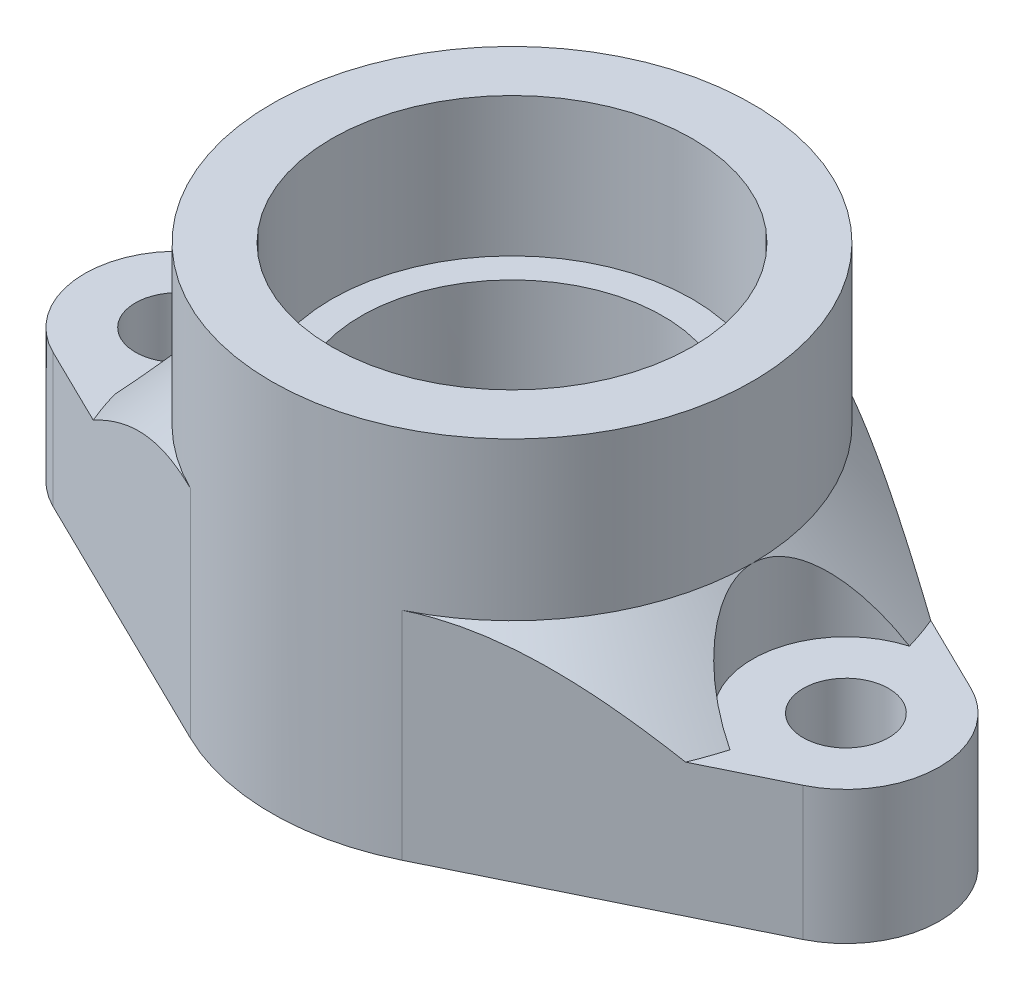
ISO-10303-21;
HEADER;
FILE_DESCRIPTION(('STEP AP214'),'2;1');
FILE_NAME('part.step','',(''),(''),'','','');
FILE_SCHEMA(('AUTOMOTIVE_DESIGN { 1 0 10303 214 1 1 1 1 }'));
ENDSEC;
DATA;
#1=APPLICATION_CONTEXT('core data for automotive mechanical design processes');
#2=APPLICATION_PROTOCOL_DEFINITION('international standard','automotive_design',2000,#1);
#3=PRODUCT_CONTEXT('',#1,'mechanical');
#4=PRODUCT('Part','Part','',(#3));
#5=PRODUCT_RELATED_PRODUCT_CATEGORY('part','',(#4));
#6=PRODUCT_DEFINITION_FORMATION('','',#4);
#7=PRODUCT_DEFINITION_CONTEXT('part definition',#1,'design');
#8=PRODUCT_DEFINITION('design','',#6,#7);
#9=PRODUCT_DEFINITION_SHAPE('','',#8);
#10=(LENGTH_UNIT() NAMED_UNIT(*) SI_UNIT(.MILLI.,.METRE.));
#11=(NAMED_UNIT(*) PLANE_ANGLE_UNIT() SI_UNIT($,.RADIAN.));
#12=(NAMED_UNIT(*) SI_UNIT($,.STERADIAN.) SOLID_ANGLE_UNIT());
#13=UNCERTAINTY_MEASURE_WITH_UNIT(LENGTH_MEASURE(1.E-05),#10,'distance_accuracy_value','');
#14=(GEOMETRIC_REPRESENTATION_CONTEXT(3) GLOBAL_UNCERTAINTY_ASSIGNED_CONTEXT((#13)) GLOBAL_UNIT_ASSIGNED_CONTEXT((#10,
#11,#12)) REPRESENTATION_CONTEXT('',''));
#15=CARTESIAN_POINT('',(0.,0.,0.));
#16=DIRECTION('',(0.,0.,1.));
#17=DIRECTION('',(1.,0.,0.));
#18=AXIS2_PLACEMENT_3D('',#15,#16,#17);
#19=CARTESIAN_POINT('',(12.5,5.,0.));
#20=DIRECTION('',(0.,-1.,0.));
#21=DIRECTION('',(0.,0.,-1.));
#22=AXIS2_PLACEMENT_3D('',#19,#20,#21);
#23=CYLINDRICAL_SURFACE('',#22,1.6);
#24=CARTESIAN_POINT('',(12.5,0.,0.));
#25=DIRECTION('',(0.,1.,0.));
#26=DIRECTION('',(0.,0.,-1.));
#27=AXIS2_PLACEMENT_3D('',#24,#25,#26);
#28=CIRCLE('',#27,1.6);
#29=CARTESIAN_POINT('',(12.5,0.,-1.6));
#30=VERTEX_POINT('',#29);
#31=EDGE_CURVE('E151',#30,#30,#28,.T.);
#32=ORIENTED_EDGE('',*,*,#31,.F.);
#33=EDGE_LOOP('',(#32));
#34=FACE_BOUND('',#33,.T.);
#35=CARTESIAN_POINT('',(12.5,5.,0.));
#36=DIRECTION('',(0.,1.,0.));
#37=DIRECTION('',(0.,0.,-1.));
#38=AXIS2_PLACEMENT_3D('',#35,#36,#37);
#39=CIRCLE('',#38,1.6);
#40=CARTESIAN_POINT('',(12.5,5.,-1.6));
#41=VERTEX_POINT('',#40);
#42=EDGE_CURVE('E522',#41,#41,#39,.T.);
#43=ORIENTED_EDGE('',*,*,#42,.T.);
#44=EDGE_LOOP('',(#43));
#45=FACE_BOUND('',#44,.T.);
#46=ADVANCED_FACE('F36',(#34,#45),#23,.F.);
#47=CARTESIAN_POINT('',(0.,5.,0.));
#48=DIRECTION('',(0.,-1.,0.));
#49=DIRECTION('',(0.,0.,-1.));
#50=AXIS2_PLACEMENT_3D('',#47,#48,#49);
#51=CONICAL_SURFACE('',#50,12.,0.7679448708775);
#52=CARTESIAN_POINT('',(0.,5.,0.));
#53=DIRECTION('',(0.,-1.,0.));
#54=DIRECTION('',(0.,0.,-1.));
#55=AXIS2_PLACEMENT_3D('',#52,#53,#54);
#56=CIRCLE('',#55,12.);
#57=CARTESIAN_POINT('',(11.52,5.,3.36));
#58=VERTEX_POINT('',#57);
#59=CARTESIAN_POINT('',(11.0876363543604,5.,4.58958822482644));
#60=VERTEX_POINT('',#59);
#61=EDGE_CURVE('E146',#58,#60,#56,.T.);
#62=ORIENTED_EDGE('',*,*,#61,.F.);
#63=CARTESIAN_POINT('',(11.5201854137369,4.9998,3.36005407345567));
#64=CARTESIAN_POINT('',(11.4551255723205,5.06997670309114,3.34107917887111));
#65=CARTESIAN_POINT('',(11.3906240049535,5.14014740494629,3.32022293353092));
#66=CARTESIAN_POINT('',(11.2628246654128,5.28037451418243,3.27475218835471));
#67=CARTESIAN_POINT('',(11.1995269600249,5.35043091502647,3.25013748069304));
#68=CARTESIAN_POINT('',(11.0113465355419,5.56052558678284,3.17056655644638));
#69=CARTESIAN_POINT('',(10.8884209428239,5.70022561447551,3.1099546432069));
#70=CARTESIAN_POINT('',(10.64733008884,5.97911140662985,2.97272420340115));
#71=CARTESIAN_POINT('',(10.5292377491211,6.11827183310221,2.89592593640598));
#72=CARTESIAN_POINT('',(10.3005427883019,6.39268754645746,2.72628623105515));
#73=CARTESIAN_POINT('',(10.1899324581157,6.5279467678781,2.63346166693734));
#74=CARTESIAN_POINT('',(9.96719689241056,6.80525955658878,2.42092364808055));
#75=CARTESIAN_POINT('',(9.85595328193928,6.94671136946978,2.29948082614157));
#76=CARTESIAN_POINT('',(9.64688603505492,7.21763480427477,2.0342502055353));
#77=CARTESIAN_POINT('',(9.54902426080143,7.3471401149555,1.89052850920296));
#78=CARTESIAN_POINT('',(9.39317583987713,7.55688644584457,1.61733500833641));
#79=CARTESIAN_POINT('',(9.33134464768782,7.64133601516534,1.49333308364829));
#80=CARTESIAN_POINT('',(9.22040901640465,7.79450273082853,1.23065653740558));
#81=CARTESIAN_POINT('',(9.17128343668485,7.86324598808395,1.09200683665216));
#82=CARTESIAN_POINT('',(9.09957533949147,7.96436011078433,0.836731478478237));
#83=CARTESIAN_POINT('',(9.07343890019289,8.00151550032862,0.723025611535535));
#84=CARTESIAN_POINT('',(9.03240545024842,8.06005377280862,0.489664777663858));
#85=CARTESIAN_POINT('',(9.01749593457978,8.08145420368919,0.370016588424023));
#86=CARTESIAN_POINT('',(9.00018869888545,8.10631031774768,0.127248291567309));
#87=CARTESIAN_POINT('',(8.99785968129376,8.10966746558025,0.00411280382596635));
#88=CARTESIAN_POINT('',(9.00614365296035,8.09775756475461,-0.24082076941409));
#89=CARTESIAN_POINT('',(9.01676057637107,8.08248485465335,-0.362618437010065));
#90=CARTESIAN_POINT('',(9.04868169536774,8.03681181939937,-0.592358319141251));
#91=CARTESIAN_POINT('',(9.06914944542203,8.00759676875353,-0.700663019115463));
#92=CARTESIAN_POINT('',(9.11891851536362,7.93703349524203,-0.911038537488009));
#93=CARTESIAN_POINT('',(9.14822330558602,7.89568050593778,-1.01310688787928));
#94=CARTESIAN_POINT('',(9.23441064344655,7.7750563248935,-1.27042338869232));
#95=CARTESIAN_POINT('',(9.29720247592483,7.68805601819695,-1.42005465233078));
#96=CARTESIAN_POINT('',(9.43709114993205,7.49737224567942,-1.70099074526134));
#97=CARTESIAN_POINT('',(9.51423212131716,7.3936374483072,-1.83223678795463));
#98=CARTESIAN_POINT('',(9.66213593931412,7.19815506903822,-2.05186978736148));
#99=CARTESIAN_POINT('',(9.73086655072568,7.10842814539402,-2.14348334171447));
#100=CARTESIAN_POINT('',(9.87409999566434,6.92400180063669,-2.31674244302911));
#101=CARTESIAN_POINT('',(9.94860628420127,6.82929941428804,-2.39838194712054));
#102=CARTESIAN_POINT('',(10.1026868598496,6.63616307164806,-2.55240591816164));
#103=CARTESIAN_POINT('',(10.182271126406,6.53772193162389,-2.6247712640941));
#104=CARTESIAN_POINT('',(10.3457379832917,6.33831837201882,-2.76051400958294));
#105=CARTESIAN_POINT('',(10.4296195429431,6.2373565599554,-2.82389355071467));
#106=CARTESIAN_POINT('',(10.5939305922785,6.04229280637617,-2.93700262621498));
#107=CARTESIAN_POINT('',(10.6740503049503,5.94833451764394,-2.98743373207773));
#108=CARTESIAN_POINT('',(10.837175623931,5.75939175043478,-3.08121154358327));
#109=CARTESIAN_POINT('',(10.9201813183512,5.66440724068759,-3.12455803269602));
#110=CARTESIAN_POINT('',(11.0880697801122,5.47461832163409,-3.20390458186388));
#111=CARTESIAN_POINT('',(11.1729306091213,5.37981923801961,-3.23996392673802));
#112=CARTESIAN_POINT('',(11.3449195152544,5.18994309444985,-3.30518175608423));
#113=CARTESIAN_POINT('',(11.4320470981367,5.09486609903749,-3.33434173112355));
#114=CARTESIAN_POINT('',(11.5201854137369,4.9998,-3.36005407345567));
#115=B_SPLINE_CURVE_WITH_KNOTS('',3,(#63,#64,#65,#66,#67,#68,#69,#70,#71,#72,#73,#74,#75,#76,
#77,#78,#79,#80,#81,#82,#83,#84,#85,#86,#87,#88,#89,#90,#91,#92,#93,#94,#95,#96,#97,#98,#99,
#100,#101,#102,#103,#104,#105,#106,#107,#108,#109,#110,#111,#112,#113,#114),.UNSPECIFIED.,.F.,
.F.,(4,2,2,2,2,2,2,2,2,2,2,2,2,2,2,2,2,2,2,2,2,2,2,2,2,4),(0.,0.292632865911583,
0.585281918936534,1.17167636664785,1.76496219390614,2.35762711267373,3.00741788527803,
3.65531635556667,4.14068195116354,4.62523468384836,4.99114344583423,5.35664403781615,
5.7241386352546,6.09174493876007,6.43252508199553,6.77343922538927,7.32267804733843,
7.87363481596813,8.30953392585679,8.74569583318114,9.18274300647771,9.61968584315244,
10.0196036438867,10.4195336651887,10.8160659781561,11.2125125443243),.UNSPECIFIED.);
#116=CARTESIAN_POINT('',(9.,8.10659094137176,0.));
#117=VERTEX_POINT('',#116);
#118=EDGE_CURVE('E11',#58,#117,#115,.T.);
#119=ORIENTED_EDGE('',*,*,#118,.T.);
#120=CARTESIAN_POINT('',(0.,8.10659094137176,0.));
#121=DIRECTION('',(0.,-1.,0.));
#122=DIRECTION('',(0.,0.,-1.));
#123=AXIS2_PLACEMENT_3D('',#120,#121,#122);
#124=CIRCLE('',#123,9.);
#125=CARTESIAN_POINT('',(3.96,8.10659094137176,8.08197995543171));
#126=VERTEX_POINT('',#125);
#127=EDGE_CURVE('E167',#126,#117,#124,.F.);
#128=ORIENTED_EDGE('',*,*,#127,.F.);
#129=CARTESIAN_POINT('',(11.0876363543604,5.,4.58958822482644));
#130=CARTESIAN_POINT('',(10.9146685693147,5.13190467172665,4.67433879740375));
#131=CARTESIAN_POINT('',(10.7405776505158,5.26201286307638,4.75963968187083));
#132=CARTESIAN_POINT('',(10.3898273462686,5.51798215062431,4.93149994538032));
#133=CARTESIAN_POINT('',(10.2131672373829,5.64384201609138,5.0180596788918));
#134=CARTESIAN_POINT('',(9.85616156007442,5.89120327324647,5.19298494348511));
#135=CARTESIAN_POINT('',(9.67580194242294,6.01267961330319,5.28135735839314));
#136=CARTESIAN_POINT('',(9.31198381297978,6.24970752390818,5.45962058108608));
#137=CARTESIAN_POINT('',(9.12852556449305,6.36525959453509,5.54951125985708));
#138=CARTESIAN_POINT('',(8.76427512711209,6.58571454386813,5.72798630433665));
#139=CARTESIAN_POINT('',(8.58359362728289,6.69084264966351,5.81651643473405));
#140=CARTESIAN_POINT('',(8.21880107946128,6.89343176338309,5.99525710191459));
#141=CARTESIAN_POINT('',(8.03468970792157,6.99089204340862,6.08546779722908));
#142=CARTESIAN_POINT('',(7.47751357261187,7.26947464881802,6.35847237135494));
#143=CARTESIAN_POINT('',(7.09882635967077,7.4372834120051,6.5440211318711));
#144=CARTESIAN_POINT('',(6.49316577926451,7.66246490233665,6.84078206318186));
#145=CARTESIAN_POINT('',(6.27108422571058,7.73627592117891,6.94959734816441));
#146=CARTESIAN_POINT('',(5.82262506015489,7.86555606794771,7.16933289630901));
#147=CARTESIAN_POINT('',(5.59624874584811,7.92103064589692,7.28025252362786));
#148=CARTESIAN_POINT('',(5.25220411560659,7.98914100255725,7.44882714807255));
#149=CARTESIAN_POINT('',(5.13572863255774,8.00943743774158,7.50589768220119));
#150=CARTESIAN_POINT('',(4.90209676321014,8.04443624016062,7.62037237871348));
#151=CARTESIAN_POINT('',(4.7849403978308,8.05913877834914,7.67777653084707));
#152=CARTESIAN_POINT('',(4.54995054496168,8.08276991439259,7.79291661069054));
#153=CARTESIAN_POINT('',(4.43211622866556,8.09168830512029,7.85065294449807));
#154=CARTESIAN_POINT('',(4.1961894361028,8.10360635630777,7.96625210506276));
#155=CARTESIAN_POINT('',(4.07809692386095,8.10660513134841,8.02411494944701));
#156=CARTESIAN_POINT('',(3.96,8.10659094137176,8.08197995543172));
#157=B_SPLINE_CURVE_WITH_KNOTS('',3,(#129,#130,#131,#132,#133,#134,#135,#136,#137,#138,#139,
#140,#141,#142,#143,#144,#145,#146,#147,#148,#149,#150,#151,#152,#153,#154,#155,#156),
.UNSPECIFIED.,.F.,.F.,(4,2,2,2,2,2,2,2,2,2,2,2,2,4),(0.,0.700367614626449,1.40093641268035,
2.1050221126994,2.80904828134457,3.48992506433244,4.17086640444912,5.52977131135749,
6.30349287971398,7.0769842725491,7.47073612104756,7.86447593521898,8.2589086942665,
8.65340044563336),.UNSPECIFIED.);
#158=EDGE_CURVE('E155',#60,#126,#157,.T.);
#159=ORIENTED_EDGE('',*,*,#158,.F.);
#160=EDGE_LOOP('',(#62,#119,#128,#159));
#161=FACE_BOUND('',#160,.T.);
#162=ADVANCED_FACE('F154',(#161),#51,.T.);
#163=CARTESIAN_POINT('',(-12.5,5.,0.));
#164=DIRECTION('',(0.,-1.,0.));
#165=DIRECTION('',(0.,0.,-1.));
#166=AXIS2_PLACEMENT_3D('',#163,#164,#165);
#167=CYLINDRICAL_SURFACE('',#166,1.6);
#168=CARTESIAN_POINT('',(-12.5,0.,0.));
#169=DIRECTION('',(0.,-1.,0.));
#170=DIRECTION('',(0.,0.,-1.));
#171=AXIS2_PLACEMENT_3D('',#168,#169,#170);
#172=CIRCLE('',#171,1.6);
#173=CARTESIAN_POINT('',(-12.5,0.,-1.6));
#174=VERTEX_POINT('',#173);
#175=EDGE_CURVE('E496',#174,#174,#172,.T.);
#176=ORIENTED_EDGE('',*,*,#175,.T.);
#177=EDGE_LOOP('',(#176));
#178=FACE_BOUND('',#177,.T.);
#179=CARTESIAN_POINT('',(-12.5,5.,0.));
#180=DIRECTION('',(0.,-1.,0.));
#181=DIRECTION('',(0.,0.,-1.));
#182=AXIS2_PLACEMENT_3D('',#179,#180,#181);
#183=CIRCLE('',#182,1.6);
#184=CARTESIAN_POINT('',(-12.5,5.,-1.6));
#185=VERTEX_POINT('',#184);
#186=EDGE_CURVE('E489',#185,#185,#183,.T.);
#187=ORIENTED_EDGE('',*,*,#186,.F.);
#188=EDGE_LOOP('',(#187));
#189=FACE_BOUND('',#188,.T.);
#190=ADVANCED_FACE('F195',(#178,#189),#167,.F.);
#191=CARTESIAN_POINT('',(0.,8.10659094137176,0.));
#192=DIRECTION('',(0.,-1.,0.));
#193=DIRECTION('',(0.,0.,-1.));
#194=AXIS2_PLACEMENT_3D('',#191,#192,#193);
#195=CONICAL_SURFACE('',#194,9.,0.7679448708775);
#196=CARTESIAN_POINT('',(-11.5201854137369,4.9998,3.36005407345567));
#197=CARTESIAN_POINT('',(-11.4551255723205,5.06997670309114,3.34107917887111));
#198=CARTESIAN_POINT('',(-11.3906240049535,5.14014740494629,3.32022293353092));
#199=CARTESIAN_POINT('',(-11.2628246654128,5.28037451418243,3.27475218835471));
#200=CARTESIAN_POINT('',(-11.1995269600249,5.35043091502647,3.25013748069304));
#201=CARTESIAN_POINT('',(-11.0113465355419,5.56052558678285,3.17056655644638));
#202=CARTESIAN_POINT('',(-10.8884209428239,5.70022561447551,3.10995464320689));
#203=CARTESIAN_POINT('',(-10.64733008884,5.97911140662985,2.97272420340115));
#204=CARTESIAN_POINT('',(-10.5292377491211,6.11827183310221,2.89592593640598));
#205=CARTESIAN_POINT('',(-10.3005427883019,6.39268754645746,2.72628623105515));
#206=CARTESIAN_POINT('',(-10.1899324581157,6.5279467678781,2.63346166693734));
#207=CARTESIAN_POINT('',(-9.96719689241056,6.80525955658878,2.42092364808055));
#208=CARTESIAN_POINT('',(-9.85595328193928,6.94671136946978,2.29948082614157));
#209=CARTESIAN_POINT('',(-9.64688603505492,7.21763480427477,2.0342502055353));
#210=CARTESIAN_POINT('',(-9.54902426080143,7.3471401149555,1.89052850920296));
#211=CARTESIAN_POINT('',(-9.39317583987713,7.55688644584456,1.61733500833642));
#212=CARTESIAN_POINT('',(-9.33134464768782,7.64133601516534,1.4933330836483));
#213=CARTESIAN_POINT('',(-9.22040901640465,7.79450273082853,1.23065653740558));
#214=CARTESIAN_POINT('',(-9.17128343668485,7.86324598808395,1.09200683665216));
#215=CARTESIAN_POINT('',(-9.09957533949147,7.96436011078433,0.836731478478237));
#216=CARTESIAN_POINT('',(-9.07343890019289,8.00151550032862,0.723025611535535));
#217=CARTESIAN_POINT('',(-9.03240545024842,8.06005377280862,0.489664777663858));
#218=CARTESIAN_POINT('',(-9.01749593457978,8.08145420368919,0.370016588424023));
#219=CARTESIAN_POINT('',(-9.00018869888545,8.10631031774768,0.127248291567309));
#220=CARTESIAN_POINT('',(-8.99785968129376,8.10966746558025,0.00411280382596605));
#221=CARTESIAN_POINT('',(-9.00614365296035,8.09775756475461,-0.240820769414091));
#222=CARTESIAN_POINT('',(-9.01676057637107,8.08248485465335,-0.362618437010066));
#223=CARTESIAN_POINT('',(-9.04868169536774,8.03681181939937,-0.592358319141251));
#224=CARTESIAN_POINT('',(-9.06914944542203,8.00759676875353,-0.700663019115463));
#225=CARTESIAN_POINT('',(-9.11891851536362,7.93703349524203,-0.911038537488009));
#226=CARTESIAN_POINT('',(-9.14822330558602,7.89568050593778,-1.01310688787928));
#227=CARTESIAN_POINT('',(-9.23441064344655,7.7750563248935,-1.27042338869232));
#228=CARTESIAN_POINT('',(-9.29720247592483,7.68805601819694,-1.42005465233078));
#229=CARTESIAN_POINT('',(-9.43709114993205,7.49737224567942,-1.70099074526134));
#230=CARTESIAN_POINT('',(-9.51423212131716,7.3936374483072,-1.83223678795463));
#231=CARTESIAN_POINT('',(-9.66213593931412,7.19815506903822,-2.05186978736148));
#232=CARTESIAN_POINT('',(-9.73086655072568,7.10842814539401,-2.14348334171447));
#233=CARTESIAN_POINT('',(-9.87409999566434,6.92400180063669,-2.31674244302911));
#234=CARTESIAN_POINT('',(-9.94860628420127,6.82929941428804,-2.39838194712054));
#235=CARTESIAN_POINT('',(-10.1026868598496,6.63616307164806,-2.55240591816164));
#236=CARTESIAN_POINT('',(-10.182271126406,6.53772193162389,-2.6247712640941));
#237=CARTESIAN_POINT('',(-10.3457379832917,6.33831837201882,-2.76051400958294));
#238=CARTESIAN_POINT('',(-10.4296195429431,6.2373565599554,-2.82389355071467));
#239=CARTESIAN_POINT('',(-10.5939305922785,6.04229280637617,-2.93700262621498));
#240=CARTESIAN_POINT('',(-10.6740503049503,5.94833451764394,-2.98743373207773));
#241=CARTESIAN_POINT('',(-10.837175623931,5.75939175043479,-3.08121154358327));
#242=CARTESIAN_POINT('',(-10.9201813183512,5.66440724068759,-3.12455803269602));
#243=CARTESIAN_POINT('',(-11.0880697801122,5.47461832163409,-3.20390458186387));
#244=CARTESIAN_POINT('',(-11.1729306091213,5.37981923801961,-3.23996392673802));
#245=CARTESIAN_POINT('',(-11.3449195152544,5.18994309444985,-3.30518175608423));
#246=CARTESIAN_POINT('',(-11.4320470981367,5.09486609903749,-3.33434173112355));
#247=CARTESIAN_POINT('',(-11.5201854137369,4.9998,-3.36005407345567));
#248=B_SPLINE_CURVE_WITH_KNOTS('',3,(#196,#197,#198,#199,#200,#201,#202,#203,#204,#205,#206,
#207,#208,#209,#210,#211,#212,#213,#214,#215,#216,#217,#218,#219,#220,#221,#222,#223,#224,#225,
#226,#227,#228,#229,#230,#231,#232,#233,#234,#235,#236,#237,#238,#239,#240,#241,#242,#243,#244,
#245,#246,#247),.UNSPECIFIED.,.F.,.F.,(4,2,2,2,2,2,2,2,2,2,2,2,2,2,2,2,2,2,2,2,2,2,2,2,2,4),(0.,
0.292632865911584,0.585281918936535,1.17167636664785,1.76496219390614,2.35762711267373,
3.00741788527803,3.65531635556667,4.14068195116353,4.62523468384836,4.99114344583423,
5.35664403781615,5.7241386352546,6.09174493876006,6.43252508199552,6.77343922538927,
7.32267804733843,7.87363481596812,8.30953392585679,8.74569583318114,9.1827430064777,
9.61968584315244,10.0196036438867,10.4195336651887,10.8160659781561,11.2125125443243),.UNSPECIFIED.);
#249=CARTESIAN_POINT('',(-11.52,5.,3.36));
#250=VERTEX_POINT('',#249);
#251=CARTESIAN_POINT('',(-9.,8.10659094137176,0.));
#252=VERTEX_POINT('',#251);
#253=EDGE_CURVE('E156',#250,#252,#248,.T.);
#254=ORIENTED_EDGE('',*,*,#253,.F.);
#255=CARTESIAN_POINT('',(0.,5.,0.));
#256=DIRECTION('',(0.,-1.,0.));
#257=DIRECTION('',(0.,0.,-1.));
#258=AXIS2_PLACEMENT_3D('',#255,#256,#257);
#259=CIRCLE('',#258,12.);
#260=CARTESIAN_POINT('',(-11.0876363543604,5.,4.58958822482644));
#261=VERTEX_POINT('',#260);
#262=EDGE_CURVE('E219',#261,#250,#259,.T.);
#263=ORIENTED_EDGE('',*,*,#262,.F.);
#264=CARTESIAN_POINT('',(-3.96,8.10659094137176,8.08197995543171));
#265=CARTESIAN_POINT('',(-4.06147756358627,8.10659621286518,8.03225808603614));
#266=CARTESIAN_POINT('',(-4.16294454820575,8.10438617794866,7.98254140011154));
#267=CARTESIAN_POINT('',(-4.36571681997759,8.09558556535997,7.88318725661644));
#268=CARTESIAN_POINT('',(-4.46702212015066,8.08899536033846,7.83354979266607));
#269=CARTESIAN_POINT('',(-4.77024181314443,8.06275227769614,7.68497852784273));
#270=CARTESIAN_POINT('',(-4.97173032786682,8.03662666617197,7.58625339827044));
#271=CARTESIAN_POINT('',(-5.37015143700612,7.96849061965392,7.39103544414383));
#272=CARTESIAN_POINT('',(-5.56710978524243,7.92666326829983,7.2945300007603));
#273=CARTESIAN_POINT('',(-5.95812328572604,7.82851037725476,7.10294161889671));
#274=CARTESIAN_POINT('',(-6.15217748312106,7.77218017538598,7.00785914827417));
#275=CARTESIAN_POINT('',(-6.70098650390592,7.5930879018283,6.73895428408338));
#276=CARTESIAN_POINT('',(-7.05163835294029,7.45464319980402,6.56714226155506));
#277=CARTESIAN_POINT('',(-7.74062800453668,7.14382814849243,6.22955183997921));
#278=CARTESIAN_POINT('',(-8.07895326361057,6.97142432545952,6.06377958697676));
#279=CARTESIAN_POINT('',(-8.74628698747705,6.60015031044091,5.73680011399066));
#280=CARTESIAN_POINT('',(-9.07522069073152,6.40111553341947,5.57562952558648));
#281=CARTESIAN_POINT('',(-9.72295759799273,5.98407616585554,5.25825208009672));
#282=CARTESIAN_POINT('',(-10.0417650044373,5.76607958872115,5.10204316390508));
#283=CARTESIAN_POINT('',(-10.4797521108791,5.4526269395591,4.88743870422146));
#284=CARTESIAN_POINT('',(-10.6024778100334,5.36323355293758,4.82730569580878));
#285=CARTESIAN_POINT('',(-10.8461920979248,5.18285081329089,4.7078908265104));
#286=CARTESIAN_POINT('',(-10.9671859924096,5.09187035438888,4.64860636592004));
#287=CARTESIAN_POINT('',(-11.0876363543604,5.00000000000001,4.58958822482644));
#288=B_SPLINE_CURVE_WITH_KNOTS('',3,(#264,#265,#266,#267,#268,#269,#270,#271,#272,#273,#274,
#275,#276,#277,#278,#279,#280,#281,#282,#283,#284,#285,#286,#287),.UNSPECIFIED.,.F.,.F.,(4,2,2,
2,2,2,2,2,2,2,2,4),(0.,0.338968317002805,0.677907799371079,1.35488611304174,2.02420433407635,
2.69373798760704,3.93432499793107,5.17614103894759,6.42602056483774,7.67537442442003,
8.16528046022304,8.65300193770819),.UNSPECIFIED.);
#289=CARTESIAN_POINT('',(-3.96,8.10659094137176,8.08197995543171));
#290=VERTEX_POINT('',#289);
#291=EDGE_CURVE('E213',#290,#261,#288,.T.);
#292=ORIENTED_EDGE('',*,*,#291,.F.);
#293=CARTESIAN_POINT('',(0.,8.10659094137176,0.));
#294=DIRECTION('',(0.,-1.,0.));
#295=DIRECTION('',(0.,0.,-1.));
#296=AXIS2_PLACEMENT_3D('',#293,#294,#295);
#297=CIRCLE('',#296,9.);
#298=EDGE_CURVE('E436',#252,#290,#297,.F.);
#299=ORIENTED_EDGE('',*,*,#298,.F.);
#300=EDGE_LOOP('',(#254,#263,#292,#299));
#301=FACE_BOUND('',#300,.T.);
#302=ADVANCED_FACE('F198',(#301),#195,.T.);
#303=CARTESIAN_POINT('',(-11.52,5.,-3.36));
#304=VERTEX_POINT('',#303);
#305=EDGE_CURVE('E159',#252,#304,#248,.T.);
#306=ORIENTED_EDGE('',*,*,#305,.F.);
#307=CARTESIAN_POINT('',(-3.96,8.10659094137176,-8.08197995543172));
#308=VERTEX_POINT('',#307);
#309=EDGE_CURVE('E431',#308,#252,#297,.F.);
#310=ORIENTED_EDGE('',*,*,#309,.F.);
#311=CARTESIAN_POINT('',(-11.0876363543604,5.,-4.58958822482644));
#312=CARTESIAN_POINT('',(-10.9146685693147,5.13190467172665,-4.67433879740375));
#313=CARTESIAN_POINT('',(-10.7405776505158,5.26201286307639,-4.75963968187083));
#314=CARTESIAN_POINT('',(-10.3898273462686,5.51798215062431,-4.93149994538032));
#315=CARTESIAN_POINT('',(-10.2131672373829,5.64384201609139,-5.0180596788918));
#316=CARTESIAN_POINT('',(-9.85616156007441,5.89120327324647,-5.19298494348511));
#317=CARTESIAN_POINT('',(-9.67580194242293,6.01267961330319,-5.28135735839315));
#318=CARTESIAN_POINT('',(-9.31198381297977,6.24970752390818,-5.45962058108608));
#319=CARTESIAN_POINT('',(-9.12852556449304,6.36525959453509,-5.54951125985708));
#320=CARTESIAN_POINT('',(-8.76427512711208,6.58571454386814,-5.72798630433665));
#321=CARTESIAN_POINT('',(-8.58359362728289,6.69084264966351,-5.81651643473405));
#322=CARTESIAN_POINT('',(-8.21880107946127,6.89343176338309,-5.99525710191459));
#323=CARTESIAN_POINT('',(-8.03468970792156,6.99089204340862,-6.08546779722908));
#324=CARTESIAN_POINT('',(-7.47751357261187,7.26947464881802,-6.35847237135494));
#325=CARTESIAN_POINT('',(-7.09882635967077,7.4372834120051,-6.5440211318711));
#326=CARTESIAN_POINT('',(-6.49316577926451,7.66246490233665,-6.84078206318186));
#327=CARTESIAN_POINT('',(-6.27108422571057,7.73627592117891,-6.94959734816441));
#328=CARTESIAN_POINT('',(-5.82262506015489,7.86555606794771,-7.16933289630901));
#329=CARTESIAN_POINT('',(-5.59624874584811,7.92103064589692,-7.28025252362786));
#330=CARTESIAN_POINT('',(-5.25220411560659,7.98914100255725,-7.44882714807255));
#331=CARTESIAN_POINT('',(-5.13572863255774,8.00943743774158,-7.50589768220119));
#332=CARTESIAN_POINT('',(-4.90209676321014,8.04443624016062,-7.62037237871348));
#333=CARTESIAN_POINT('',(-4.7849403978308,8.05913877834914,-7.67777653084707));
#334=CARTESIAN_POINT('',(-4.54995054496168,8.08276991439259,-7.79291661069054));
#335=CARTESIAN_POINT('',(-4.43211622866556,8.09168830512029,-7.85065294449807));
#336=CARTESIAN_POINT('',(-4.1961894361028,8.10360635630778,-7.96625210506276));
#337=CARTESIAN_POINT('',(-4.07809692386095,8.10660513134841,-8.02411494944701));
#338=CARTESIAN_POINT('',(-3.96,8.10659094137176,-8.08197995543171));
#339=B_SPLINE_CURVE_WITH_KNOTS('',3,(#311,#312,#313,#314,#315,#316,#317,#318,#319,#320,#321,
#322,#323,#324,#325,#326,#327,#328,#329,#330,#331,#332,#333,#334,#335,#336,#337,#338),
.UNSPECIFIED.,.F.,.F.,(4,2,2,2,2,2,2,2,2,2,2,2,2,4),(0.,0.700367614626448,1.40093641268035,
2.1050221126994,2.80904828134457,3.48992506433244,4.17086640444912,5.52977131135748,
6.30349287971398,7.07698427254909,7.47073612104756,7.86447593521898,8.25890869426649,
8.65340044563336),.UNSPECIFIED.);
#340=CARTESIAN_POINT('',(-11.0876363543604,5.,-4.58958822482644));
#341=VERTEX_POINT('',#340);
#342=EDGE_CURVE('E218',#341,#308,#339,.T.);
#343=ORIENTED_EDGE('',*,*,#342,.F.);
#344=CARTESIAN_POINT('',(0.,5.,0.));
#345=DIRECTION('',(0.,-1.,0.));
#346=DIRECTION('',(0.,0.,-1.));
#347=AXIS2_PLACEMENT_3D('',#344,#345,#346);
#348=CIRCLE('',#347,12.);
#349=EDGE_CURVE('E432',#304,#341,#348,.T.);
#350=ORIENTED_EDGE('',*,*,#349,.F.);
#351=EDGE_LOOP('',(#306,#310,#343,#350));
#352=FACE_BOUND('',#351,.T.);
#353=ADVANCED_FACE('F227',(#352),#195,.T.);
#354=CARTESIAN_POINT('',(0.,14.,0.));
#355=DIRECTION('',(0.,-1.,0.));
#356=DIRECTION('',(0.,0.,-1.));
#357=AXIS2_PLACEMENT_3D('',#354,#355,#356);
#358=CYLINDRICAL_SURFACE('',#357,9.);
#359=ORIENTED_EDGE('',*,*,#127,.T.);
#360=CARTESIAN_POINT('',(3.96,8.10659094137176,-8.08197995543172));
#361=VERTEX_POINT('',#360);
#362=EDGE_CURVE('E62',#117,#361,#124,.F.);
#363=ORIENTED_EDGE('',*,*,#362,.T.);
#364=DIRECTION('',(0.,-1.,0.));
#365=VECTOR('',#364,1.);
#366=CARTESIAN_POINT('',(3.96,5.,-8.08197995543172));
#367=LINE('',#366,#365);
#368=CARTESIAN_POINT('',(3.96,0.,-8.08197995543172));
#369=VERTEX_POINT('',#368);
#370=EDGE_CURVE('E509',#361,#369,#367,.T.);
#371=ORIENTED_EDGE('',*,*,#370,.T.);
#372=CARTESIAN_POINT('',(0.,0.,0.));
#373=DIRECTION('',(0.,1.,0.));
#374=DIRECTION('',(0.,0.,1.));
#375=AXIS2_PLACEMENT_3D('',#372,#373,#374);
#376=CIRCLE('',#375,9.);
#377=CARTESIAN_POINT('',(-3.96,0.,-8.08197995543171));
#378=VERTEX_POINT('',#377);
#379=EDGE_CURVE('E455',#369,#378,#376,.T.);
#380=ORIENTED_EDGE('',*,*,#379,.T.);
#381=DIRECTION('',(0.,-1.,0.));
#382=VECTOR('',#381,1.);
#383=CARTESIAN_POINT('',(-3.96,5.,-8.08197995543172));
#384=LINE('',#383,#382);
#385=EDGE_CURVE('E445',#308,#378,#384,.T.);
#386=ORIENTED_EDGE('',*,*,#385,.F.);
#387=ORIENTED_EDGE('',*,*,#309,.T.);
#388=ORIENTED_EDGE('',*,*,#298,.T.);
#389=DIRECTION('',(0.,-1.,0.));
#390=VECTOR('',#389,1.);
#391=CARTESIAN_POINT('',(-3.96,5.,8.08197995543172));
#392=LINE('',#391,#390);
#393=CARTESIAN_POINT('',(-3.96,0.,8.08197995543172));
#394=VERTEX_POINT('',#393);
#395=EDGE_CURVE('E476',#290,#394,#392,.T.);
#396=ORIENTED_EDGE('',*,*,#395,.T.);
#397=CARTESIAN_POINT('',(3.96,0.,8.08197995543172));
#398=VERTEX_POINT('',#397);
#399=EDGE_CURVE('E453',#394,#398,#376,.T.);
#400=ORIENTED_EDGE('',*,*,#399,.T.);
#401=DIRECTION('',(0.,-1.,0.));
#402=VECTOR('',#401,1.);
#403=CARTESIAN_POINT('',(3.96,5.,8.08197995543172));
#404=LINE('',#403,#402);
#405=EDGE_CURVE('E56',#126,#398,#404,.T.);
#406=ORIENTED_EDGE('',*,*,#405,.F.);
#407=EDGE_LOOP('',(#359,#363,#371,#380,#386,#387,#388,#396,#400,#406));
#408=FACE_BOUND('',#407,.T.);
#409=CARTESIAN_POINT('',(0.,14.,0.));
#410=DIRECTION('',(0.,1.,0.));
#411=DIRECTION('',(0.,0.,1.));
#412=AXIS2_PLACEMENT_3D('',#409,#410,#411);
#413=CIRCLE('',#412,9.);
#414=CARTESIAN_POINT('',(0.,14.,9.));
#415=VERTEX_POINT('',#414);
#416=EDGE_CURVE('E441',#415,#415,#413,.T.);
#417=ORIENTED_EDGE('',*,*,#416,.F.);
#418=EDGE_LOOP('',(#417));
#419=FACE_BOUND('',#418,.T.);
#420=ADVANCED_FACE('F229',(#408,#419),#358,.T.);
#421=CARTESIAN_POINT('',(0.,14.,0.));
#422=DIRECTION('',(0.,1.,0.));
#423=DIRECTION('',(0.,0.,1.));
#424=AXIS2_PLACEMENT_3D('',#421,#422,#423);
#425=PLANE('',#424);
#426=CARTESIAN_POINT('',(0.,14.,0.));
#427=DIRECTION('',(0.,1.,0.));
#428=DIRECTION('',(0.,0.,1.));
#429=AXIS2_PLACEMENT_3D('',#426,#427,#428);
#430=CIRCLE('',#429,6.75);
#431=CARTESIAN_POINT('',(0.,14.,6.75));
#432=VERTEX_POINT('',#431);
#433=EDGE_CURVE('E458',#432,#432,#430,.T.);
#434=ORIENTED_EDGE('',*,*,#433,.F.);
#435=EDGE_LOOP('',(#434));
#436=FACE_BOUND('',#435,.T.);
#437=ORIENTED_EDGE('',*,*,#416,.T.);
#438=EDGE_LOOP('',(#437));
#439=FACE_BOUND('',#438,.T.);
#440=ADVANCED_FACE('F234',(#436,#439),#425,.T.);
#441=CARTESIAN_POINT('',(0.,0.,0.));
#442=DIRECTION('',(0.,1.,0.));
#443=DIRECTION('',(0.,0.,1.));
#444=AXIS2_PLACEMENT_3D('',#441,#442,#443);
#445=PLANE('',#444);
#446=CARTESIAN_POINT('',(0.,0.,0.));
#447=DIRECTION('',(0.,-1.,0.));
#448=DIRECTION('',(0.,0.,-1.));
#449=AXIS2_PLACEMENT_3D('',#446,#447,#448);
#450=CIRCLE('',#449,6.75);
#451=CARTESIAN_POINT('',(0.,0.,-6.75));
#452=VERTEX_POINT('',#451);
#453=EDGE_CURVE('E451',#452,#452,#450,.T.);
#454=ORIENTED_EDGE('',*,*,#453,.F.);
#455=EDGE_LOOP('',(#454));
#456=FACE_BOUND('',#455,.T.);
#457=ORIENTED_EDGE('',*,*,#399,.F.);
#458=DIRECTION('',(-0.897997772825746,0.,-0.44));
#459=VECTOR('',#458,1.);
#460=CARTESIAN_POINT('',(-14.04,0.,3.14299220489011));
#461=LINE('',#460,#459);
#462=CARTESIAN_POINT('',(-14.04,0.,3.14299220489011));
#463=VERTEX_POINT('',#462);
#464=EDGE_CURVE('E479',#394,#463,#461,.T.);
#465=ORIENTED_EDGE('',*,*,#464,.T.);
#466=CARTESIAN_POINT('',(-12.5,0.,0.));
#467=DIRECTION('',(0.,-1.,0.));
#468=DIRECTION('',(0.,0.,-1.));
#469=AXIS2_PLACEMENT_3D('',#466,#467,#468);
#470=CIRCLE('',#469,3.5);
#471=CARTESIAN_POINT('',(-14.04,0.,-3.14299220489011));
#472=VERTEX_POINT('',#471);
#473=EDGE_CURVE('E486',#463,#472,#470,.T.);
#474=ORIENTED_EDGE('',*,*,#473,.T.);
#475=DIRECTION('',(0.897997772825746,0.,-0.44));
#476=VECTOR('',#475,1.);
#477=CARTESIAN_POINT('',(-14.04,0.,-3.14299220489011));
#478=LINE('',#477,#476);
#479=EDGE_CURVE('E483',#472,#378,#478,.T.);
#480=ORIENTED_EDGE('',*,*,#479,.T.);
#481=ORIENTED_EDGE('',*,*,#379,.F.);
#482=DIRECTION('',(-0.897997772825746,0.,-0.44));
#483=VECTOR('',#482,1.);
#484=CARTESIAN_POINT('',(14.04,0.,-3.14299220489011));
#485=LINE('',#484,#483);
#486=CARTESIAN_POINT('',(14.04,0.,-3.14299220489011));
#487=VERTEX_POINT('',#486);
#488=EDGE_CURVE('E513',#487,#369,#485,.T.);
#489=ORIENTED_EDGE('',*,*,#488,.F.);
#490=CARTESIAN_POINT('',(12.5,0.,0.));
#491=DIRECTION('',(0.,1.,0.));
#492=DIRECTION('',(0.,0.,-1.));
#493=AXIS2_PLACEMENT_3D('',#490,#491,#492);
#494=CIRCLE('',#493,3.5);
#495=CARTESIAN_POINT('',(14.04,0.,3.14299220489011));
#496=VERTEX_POINT('',#495);
#497=EDGE_CURVE('E519',#496,#487,#494,.T.);
#498=ORIENTED_EDGE('',*,*,#497,.F.);
#499=DIRECTION('',(0.897997772825746,0.,-0.44));
#500=VECTOR('',#499,1.);
#501=CARTESIAN_POINT('',(14.04,0.,3.14299220489011));
#502=LINE('',#501,#500);
#503=EDGE_CURVE('E517',#398,#496,#502,.T.);
#504=ORIENTED_EDGE('',*,*,#503,.F.);
#505=EDGE_LOOP('',(#457,#465,#474,#480,#481,#489,#498,#504));
#506=FACE_BOUND('',#505,.T.);
#507=ORIENTED_EDGE('',*,*,#175,.F.);
#508=EDGE_LOOP('',(#507));
#509=FACE_BOUND('',#508,.T.);
#510=ORIENTED_EDGE('',*,*,#31,.T.);
#511=EDGE_LOOP('',(#510));
#512=FACE_BOUND('',#511,.T.);
#513=ADVANCED_FACE('F235',(#456,#506,#509,#512),#445,.F.);
#514=CARTESIAN_POINT('',(0.,8.8,0.));
#515=DIRECTION('',(0.,1.,0.));
#516=DIRECTION('',(0.,0.,1.));
#517=AXIS2_PLACEMENT_3D('',#514,#515,#516);
#518=CYLINDRICAL_SURFACE('',#517,6.75);
#519=CARTESIAN_POINT('',(0.,8.8,0.));
#520=DIRECTION('',(0.,1.,0.));
#521=DIRECTION('',(0.,0.,1.));
#522=AXIS2_PLACEMENT_3D('',#519,#520,#521);
#523=CIRCLE('',#522,6.75);
#524=CARTESIAN_POINT('',(0.,8.8,6.75));
#525=VERTEX_POINT('',#524);
#526=EDGE_CURVE('E461',#525,#525,#523,.T.);
#527=ORIENTED_EDGE('',*,*,#526,.F.);
#528=EDGE_LOOP('',(#527));
#529=FACE_BOUND('',#528,.T.);
#530=ORIENTED_EDGE('',*,*,#433,.T.);
#531=EDGE_LOOP('',(#530));
#532=FACE_BOUND('',#531,.T.);
#533=ADVANCED_FACE('F238',(#529,#532),#518,.F.);
#534=CARTESIAN_POINT('',(0.,8.8,0.));
#535=DIRECTION('',(0.,1.,0.));
#536=DIRECTION('',(0.,0.,1.));
#537=AXIS2_PLACEMENT_3D('',#534,#535,#536);
#538=PLANE('',#537);
#539=CARTESIAN_POINT('',(0.,8.8,0.));
#540=DIRECTION('',(0.,1.,0.));
#541=DIRECTION('',(0.,0.,1.));
#542=AXIS2_PLACEMENT_3D('',#539,#540,#541);
#543=CIRCLE('',#542,5.65);
#544=CARTESIAN_POINT('',(0.,8.8,5.65));
#545=VERTEX_POINT('',#544);
#546=EDGE_CURVE('E452',#545,#545,#543,.T.);
#547=ORIENTED_EDGE('',*,*,#546,.F.);
#548=EDGE_LOOP('',(#547));
#549=FACE_BOUND('',#548,.T.);
#550=ORIENTED_EDGE('',*,*,#526,.T.);
#551=EDGE_LOOP('',(#550));
#552=FACE_BOUND('',#551,.T.);
#553=ADVANCED_FACE('F245',(#549,#552),#538,.T.);
#554=CARTESIAN_POINT('',(0.,5.2,0.));
#555=DIRECTION('',(0.,-1.,0.));
#556=DIRECTION('',(0.,0.,-1.));
#557=AXIS2_PLACEMENT_3D('',#554,#555,#556);
#558=CYLINDRICAL_SURFACE('',#557,6.75);
#559=CARTESIAN_POINT('',(0.,5.2,0.));
#560=DIRECTION('',(0.,-1.,0.));
#561=DIRECTION('',(0.,0.,-1.));
#562=AXIS2_PLACEMENT_3D('',#559,#560,#561);
#563=CIRCLE('',#562,6.75);
#564=CARTESIAN_POINT('',(0.,5.2,-6.75));
#565=VERTEX_POINT('',#564);
#566=EDGE_CURVE('E462',#565,#565,#563,.T.);
#567=ORIENTED_EDGE('',*,*,#566,.F.);
#568=EDGE_LOOP('',(#567));
#569=FACE_BOUND('',#568,.T.);
#570=ORIENTED_EDGE('',*,*,#453,.T.);
#571=EDGE_LOOP('',(#570));
#572=FACE_BOUND('',#571,.T.);
#573=ADVANCED_FACE('F249',(#569,#572),#558,.F.);
#574=CARTESIAN_POINT('',(0.,5.2,0.));
#575=DIRECTION('',(0.,-1.,0.));
#576=DIRECTION('',(0.,0.,-1.));
#577=AXIS2_PLACEMENT_3D('',#574,#575,#576);
#578=PLANE('',#577);
#579=CARTESIAN_POINT('',(0.,5.2,0.));
#580=DIRECTION('',(0.,-1.,0.));
#581=DIRECTION('',(0.,0.,-1.));
#582=AXIS2_PLACEMENT_3D('',#579,#580,#581);
#583=CIRCLE('',#582,5.65);
#584=CARTESIAN_POINT('',(0.,5.2,-5.65));
#585=VERTEX_POINT('',#584);
#586=EDGE_CURVE('E448',#585,#585,#583,.T.);
#587=ORIENTED_EDGE('',*,*,#586,.F.);
#588=EDGE_LOOP('',(#587));
#589=FACE_BOUND('',#588,.T.);
#590=ORIENTED_EDGE('',*,*,#566,.T.);
#591=EDGE_LOOP('',(#590));
#592=FACE_BOUND('',#591,.T.);
#593=ADVANCED_FACE('F253',(#589,#592),#578,.T.);
#594=CARTESIAN_POINT('',(0.,0.,0.));
#595=DIRECTION('',(0.,1.,0.));
#596=DIRECTION('',(0.,0.,1.));
#597=AXIS2_PLACEMENT_3D('',#594,#595,#596);
#598=CYLINDRICAL_SURFACE('',#597,5.65);
#599=ORIENTED_EDGE('',*,*,#586,.T.);
#600=EDGE_LOOP('',(#599));
#601=FACE_BOUND('',#600,.T.);
#602=ORIENTED_EDGE('',*,*,#546,.T.);
#603=EDGE_LOOP('',(#602));
#604=FACE_BOUND('',#603,.T.);
#605=ADVANCED_FACE('F257',(#601,#604),#598,.F.);
#606=CARTESIAN_POINT('',(-12.5,5.,0.));
#607=DIRECTION('',(0.,-1.,0.));
#608=DIRECTION('',(0.,0.,-1.));
#609=AXIS2_PLACEMENT_3D('',#606,#607,#608);
#610=CYLINDRICAL_SURFACE('',#609,3.5);
#611=ORIENTED_EDGE('',*,*,#473,.F.);
#612=DIRECTION('',(0.,-1.,0.));
#613=VECTOR('',#612,1.);
#614=CARTESIAN_POINT('',(-14.04,5.,3.14299220489011));
#615=LINE('',#614,#613);
#616=CARTESIAN_POINT('',(-14.04,5.,3.14299220489011));
#617=VERTEX_POINT('',#616);
#618=EDGE_CURVE('E471',#617,#463,#615,.T.);
#619=ORIENTED_EDGE('',*,*,#618,.F.);
#620=CARTESIAN_POINT('',(-12.5,5.,0.));
#621=DIRECTION('',(0.,-1.,0.));
#622=DIRECTION('',(0.,0.,-1.));
#623=AXIS2_PLACEMENT_3D('',#620,#621,#622);
#624=CIRCLE('',#623,3.5);
#625=CARTESIAN_POINT('',(-14.04,5.,-3.14299220489011));
#626=VERTEX_POINT('',#625);
#627=EDGE_CURVE('E482',#617,#626,#624,.T.);
#628=ORIENTED_EDGE('',*,*,#627,.T.);
#629=DIRECTION('',(0.,-1.,0.));
#630=VECTOR('',#629,1.);
#631=CARTESIAN_POINT('',(-14.04,5.,-3.14299220489011));
#632=LINE('',#631,#630);
#633=EDGE_CURVE('E472',#626,#472,#632,.T.);
#634=ORIENTED_EDGE('',*,*,#633,.T.);
#635=EDGE_LOOP('',(#611,#619,#628,#634));
#636=FACE_BOUND('',#635,.T.);
#637=ADVANCED_FACE('F208',(#636),#610,.T.);
#638=CARTESIAN_POINT('',(-14.04,5.,3.14299220489011));
#639=DIRECTION('',(-0.44,0.,0.897997772825746));
#640=DIRECTION('',(0.897997772825746,0.,0.44));
#641=AXIS2_PLACEMENT_3D('',#638,#639,#640);
#642=PLANE('',#641);
#643=ORIENTED_EDGE('',*,*,#464,.F.);
#644=ORIENTED_EDGE('',*,*,#395,.F.);
#645=ORIENTED_EDGE('',*,*,#291,.T.);
#646=DIRECTION('',(-0.897997772825746,0.,-0.44));
#647=VECTOR('',#646,1.);
#648=CARTESIAN_POINT('',(-14.04,5.,3.14299220489011));
#649=LINE('',#648,#647);
#650=EDGE_CURVE('E474',#261,#617,#649,.T.);
#651=ORIENTED_EDGE('',*,*,#650,.T.);
#652=ORIENTED_EDGE('',*,*,#618,.T.);
#653=EDGE_LOOP('',(#643,#644,#645,#651,#652));
#654=FACE_BOUND('',#653,.T.);
#655=ADVANCED_FACE('F204',(#654),#642,.T.);
#656=CARTESIAN_POINT('',(-14.04,5.,-3.14299220489011));
#657=DIRECTION('',(-0.44,0.,-0.897997772825746));
#658=DIRECTION('',(-0.897997772825746,0.,0.44));
#659=AXIS2_PLACEMENT_3D('',#656,#657,#658);
#660=PLANE('',#659);
#661=ORIENTED_EDGE('',*,*,#479,.F.);
#662=ORIENTED_EDGE('',*,*,#633,.F.);
#663=DIRECTION('',(0.897997772825746,0.,-0.44));
#664=VECTOR('',#663,1.);
#665=CARTESIAN_POINT('',(-14.04,5.,-3.14299220489011));
#666=LINE('',#665,#664);
#667=EDGE_CURVE('E491',#626,#341,#666,.T.);
#668=ORIENTED_EDGE('',*,*,#667,.T.);
#669=ORIENTED_EDGE('',*,*,#342,.T.);
#670=ORIENTED_EDGE('',*,*,#385,.T.);
#671=EDGE_LOOP('',(#661,#662,#668,#669,#670));
#672=FACE_BOUND('',#671,.T.);
#673=ADVANCED_FACE('F202',(#672),#660,.T.);
#674=CARTESIAN_POINT('',(-12.5,5.,0.));
#675=DIRECTION('',(0.,-1.,0.));
#676=DIRECTION('',(0.,0.,-1.));
#677=AXIS2_PLACEMENT_3D('',#674,#675,#676);
#678=PLANE('',#677);
#679=ORIENTED_EDGE('',*,*,#667,.F.);
#680=ORIENTED_EDGE('',*,*,#627,.F.);
#681=ORIENTED_EDGE('',*,*,#650,.F.);
#682=ORIENTED_EDGE('',*,*,#262,.T.);
#683=CARTESIAN_POINT('',(-12.5,5.,0.));
#684=DIRECTION('',(0.,1.,0.));
#685=DIRECTION('',(0.,0.,1.));
#686=AXIS2_PLACEMENT_3D('',#683,#684,#685);
#687=CIRCLE('',#686,3.5);
#688=EDGE_CURVE('E499',#250,#304,#687,.T.);
#689=ORIENTED_EDGE('',*,*,#688,.T.);
#690=ORIENTED_EDGE('',*,*,#349,.T.);
#691=EDGE_LOOP('',(#679,#680,#681,#682,#689,#690));
#692=FACE_BOUND('',#691,.T.);
#693=ORIENTED_EDGE('',*,*,#186,.T.);
#694=EDGE_LOOP('',(#693));
#695=FACE_BOUND('',#694,.T.);
#696=ADVANCED_FACE('F193',(#692,#695),#678,.F.);
#697=CARTESIAN_POINT('',(-12.5,14.,0.));
#698=DIRECTION('',(0.,-1.,0.));
#699=DIRECTION('',(0.,0.,-1.));
#700=AXIS2_PLACEMENT_3D('',#697,#698,#699);
#701=CYLINDRICAL_SURFACE('',#700,3.5);
#702=ORIENTED_EDGE('',*,*,#253,.T.);
#703=ORIENTED_EDGE('',*,*,#305,.T.);
#704=ORIENTED_EDGE('',*,*,#688,.F.);
#705=EDGE_LOOP('',(#702,#703,#704));
#706=FACE_BOUND('',#705,.T.);
#707=ADVANCED_FACE('F189',(#706),#701,.F.);
#708=CARTESIAN_POINT('',(12.5,5.,0.));
#709=DIRECTION('',(0.,-1.,0.));
#710=DIRECTION('',(0.,0.,-1.));
#711=AXIS2_PLACEMENT_3D('',#708,#709,#710);
#712=PLANE('',#711);
#713=CARTESIAN_POINT('',(0.,5.,0.));
#714=DIRECTION('',(0.,-1.,0.));
#715=DIRECTION('',(0.,0.,-1.));
#716=AXIS2_PLACEMENT_3D('',#713,#714,#715);
#717=CIRCLE('',#716,12.);
#718=CARTESIAN_POINT('',(11.0876363543604,5.,-4.58958822482644));
#719=VERTEX_POINT('',#718);
#720=CARTESIAN_POINT('',(11.52,5.,-3.36));
#721=VERTEX_POINT('',#720);
#722=EDGE_CURVE('E150',#719,#721,#717,.T.);
#723=ORIENTED_EDGE('',*,*,#722,.T.);
#724=CARTESIAN_POINT('',(12.5,5.,0.));
#725=DIRECTION('',(0.,-1.,0.));
#726=DIRECTION('',(0.,0.,1.));
#727=AXIS2_PLACEMENT_3D('',#724,#725,#726);
#728=CIRCLE('',#727,3.5);
#729=EDGE_CURVE('E137',#58,#721,#728,.T.);
#730=ORIENTED_EDGE('',*,*,#729,.F.);
#731=ORIENTED_EDGE('',*,*,#61,.T.);
#732=DIRECTION('',(0.897997772825746,0.,-0.44));
#733=VECTOR('',#732,1.);
#734=CARTESIAN_POINT('',(14.04,5.,3.14299220489011));
#735=LINE('',#734,#733);
#736=CARTESIAN_POINT('',(14.04,5.,3.14299220489011));
#737=VERTEX_POINT('',#736);
#738=EDGE_CURVE('E524',#60,#737,#735,.T.);
#739=ORIENTED_EDGE('',*,*,#738,.T.);
#740=CARTESIAN_POINT('',(12.5,5.,0.));
#741=DIRECTION('',(0.,1.,0.));
#742=DIRECTION('',(0.,0.,-1.));
#743=AXIS2_PLACEMENT_3D('',#740,#741,#742);
#744=CIRCLE('',#743,3.5);
#745=CARTESIAN_POINT('',(14.04,5.,-3.14299220489011));
#746=VERTEX_POINT('',#745);
#747=EDGE_CURVE('E516',#737,#746,#744,.T.);
#748=ORIENTED_EDGE('',*,*,#747,.T.);
#749=DIRECTION('',(-0.897997772825746,0.,-0.44));
#750=VECTOR('',#749,1.);
#751=CARTESIAN_POINT('',(14.04,5.,-3.14299220489011));
#752=LINE('',#751,#750);
#753=EDGE_CURVE('E507',#746,#719,#752,.T.);
#754=ORIENTED_EDGE('',*,*,#753,.T.);
#755=EDGE_LOOP('',(#723,#730,#731,#739,#748,#754));
#756=FACE_BOUND('',#755,.T.);
#757=ORIENTED_EDGE('',*,*,#42,.F.);
#758=EDGE_LOOP('',(#757));
#759=FACE_BOUND('',#758,.T.);
#760=ADVANCED_FACE('F144',(#756,#759),#712,.F.);
#761=CARTESIAN_POINT('',(12.5,5.,0.));
#762=DIRECTION('',(0.,-1.,0.));
#763=DIRECTION('',(0.,0.,-1.));
#764=AXIS2_PLACEMENT_3D('',#761,#762,#763);
#765=CYLINDRICAL_SURFACE('',#764,3.5);
#766=ORIENTED_EDGE('',*,*,#497,.T.);
#767=DIRECTION('',(0.,-1.,0.));
#768=VECTOR('',#767,1.);
#769=CARTESIAN_POINT('',(14.04,5.,-3.14299220489011));
#770=LINE('',#769,#768);
#771=EDGE_CURVE('E503',#746,#487,#770,.T.);
#772=ORIENTED_EDGE('',*,*,#771,.F.);
#773=ORIENTED_EDGE('',*,*,#747,.F.);
#774=DIRECTION('',(0.,-1.,0.));
#775=VECTOR('',#774,1.);
#776=CARTESIAN_POINT('',(14.04,5.,3.14299220489011));
#777=LINE('',#776,#775);
#778=EDGE_CURVE('E504',#737,#496,#777,.T.);
#779=ORIENTED_EDGE('',*,*,#778,.T.);
#780=EDGE_LOOP('',(#766,#772,#773,#779));
#781=FACE_BOUND('',#780,.T.);
#782=ADVANCED_FACE('F186',(#781),#765,.T.);
#783=CARTESIAN_POINT('',(14.04,5.,-3.14299220489011));
#784=DIRECTION('',(-0.44,0.,0.897997772825746));
#785=DIRECTION('',(0.897997772825746,0.,0.44));
#786=AXIS2_PLACEMENT_3D('',#783,#784,#785);
#787=PLANE('',#786);
#788=ORIENTED_EDGE('',*,*,#488,.T.);
#789=ORIENTED_EDGE('',*,*,#370,.F.);
#790=CARTESIAN_POINT('',(3.96,8.10659094137176,-8.08197995543171));
#791=CARTESIAN_POINT('',(4.06147756358627,8.10659621286518,-8.03225808603614));
#792=CARTESIAN_POINT('',(4.16294454820575,8.10438617794866,-7.98254140011154));
#793=CARTESIAN_POINT('',(4.36571681997759,8.09558556535997,-7.88318725661644));
#794=CARTESIAN_POINT('',(4.46702212015065,8.08899536033847,-7.83354979266607));
#795=CARTESIAN_POINT('',(4.77024181314442,8.06275227769614,-7.68497852784273));
#796=CARTESIAN_POINT('',(4.97173032786682,8.03662666617197,-7.58625339827044));
#797=CARTESIAN_POINT('',(5.37015143700612,7.96849061965392,-7.39103544414383));
#798=CARTESIAN_POINT('',(5.56710978524242,7.92666326829983,-7.2945300007603));
#799=CARTESIAN_POINT('',(5.95812328572604,7.82851037725476,-7.10294161889671));
#800=CARTESIAN_POINT('',(6.15217748312105,7.77218017538598,-7.00785914827417));
#801=CARTESIAN_POINT('',(6.70098650390592,7.5930879018283,-6.73895428408338));
#802=CARTESIAN_POINT('',(7.05163835294028,7.45464319980403,-6.56714226155506));
#803=CARTESIAN_POINT('',(7.74062800453668,7.14382814849243,-6.22955183997921));
#804=CARTESIAN_POINT('',(8.07895326361057,6.97142432545952,-6.06377958697676));
#805=CARTESIAN_POINT('',(8.74628698747704,6.60015031044091,-5.73680011399066));
#806=CARTESIAN_POINT('',(9.07522069073152,6.40111553341947,-5.57562952558648));
#807=CARTESIAN_POINT('',(9.72295759799273,5.98407616585554,-5.25825208009672));
#808=CARTESIAN_POINT('',(10.0417650044373,5.76607958872115,-5.10204316390508));
#809=CARTESIAN_POINT('',(10.4797521108791,5.4526269395591,-4.88743870422146));
#810=CARTESIAN_POINT('',(10.6024778100334,5.36323355293758,-4.82730569580878));
#811=CARTESIAN_POINT('',(10.8461920979248,5.18285081329089,-4.7078908265104));
#812=CARTESIAN_POINT('',(10.9671859924096,5.09187035438888,-4.64860636592004));
#813=CARTESIAN_POINT('',(11.0876363543604,5.00000000000001,-4.58958822482644));
#814=B_SPLINE_CURVE_WITH_KNOTS('',3,(#790,#791,#792,#793,#794,#795,#796,#797,#798,#799,#800,
#801,#802,#803,#804,#805,#806,#807,#808,#809,#810,#811,#812,#813),.UNSPECIFIED.,.F.,.F.,(4,2,2,
2,2,2,2,2,2,2,2,4),(0.,0.338968317002804,0.677907799371077,1.35488611304174,2.02420433407635,
2.69373798760705,3.93432499793107,5.17614103894759,6.42602056483774,7.67537442442003,
8.16528046022304,8.65300193770819),.UNSPECIFIED.);
#815=EDGE_CURVE('E173',#361,#719,#814,.T.);
#816=ORIENTED_EDGE('',*,*,#815,.T.);
#817=ORIENTED_EDGE('',*,*,#753,.F.);
#818=ORIENTED_EDGE('',*,*,#771,.T.);
#819=EDGE_LOOP('',(#788,#789,#816,#817,#818));
#820=FACE_BOUND('',#819,.T.);
#821=ADVANCED_FACE('F182',(#820),#787,.F.);
#822=CARTESIAN_POINT('',(14.04,5.,3.14299220489011));
#823=DIRECTION('',(-0.44,0.,-0.897997772825746));
#824=DIRECTION('',(-0.897997772825746,0.,0.44));
#825=AXIS2_PLACEMENT_3D('',#822,#823,#824);
#826=PLANE('',#825);
#827=ORIENTED_EDGE('',*,*,#503,.T.);
#828=ORIENTED_EDGE('',*,*,#778,.F.);
#829=ORIENTED_EDGE('',*,*,#738,.F.);
#830=ORIENTED_EDGE('',*,*,#158,.T.);
#831=ORIENTED_EDGE('',*,*,#405,.T.);
#832=EDGE_LOOP('',(#827,#828,#829,#830,#831));
#833=FACE_BOUND('',#832,.T.);
#834=ADVANCED_FACE('F178',(#833),#826,.F.);
#835=ORIENTED_EDGE('',*,*,#362,.F.);
#836=EDGE_CURVE('E41',#117,#721,#115,.T.);
#837=ORIENTED_EDGE('',*,*,#836,.T.);
#838=ORIENTED_EDGE('',*,*,#722,.F.);
#839=ORIENTED_EDGE('',*,*,#815,.F.);
#840=EDGE_LOOP('',(#835,#837,#838,#839));
#841=FACE_BOUND('',#840,.T.);
#842=ADVANCED_FACE('F38',(#841),#51,.T.);
#843=CARTESIAN_POINT('',(12.5,14.,0.));
#844=DIRECTION('',(0.,-1.,0.));
#845=DIRECTION('',(0.,0.,-1.));
#846=AXIS2_PLACEMENT_3D('',#843,#844,#845);
#847=CYLINDRICAL_SURFACE('',#846,3.5);
#848=ORIENTED_EDGE('',*,*,#729,.T.);
#849=ORIENTED_EDGE('',*,*,#836,.F.);
#850=ORIENTED_EDGE('',*,*,#118,.F.);
#851=EDGE_LOOP('',(#848,#849,#850));
#852=FACE_BOUND('',#851,.T.);
#853=ADVANCED_FACE('F136',(#852),#847,.F.);
#854=CLOSED_SHELL('',(#46,#162,#190,#302,#353,#420,#440,#513,#533,#553,#573,#593,#605,#637,#655,
#673,#696,#707,#760,#782,#821,#834,#842,#853));
#855=MANIFOLD_SOLID_BREP('B2',#854);
#856=ADVANCED_BREP_SHAPE_REPRESENTATION('',(#18,#855),#14);
#857=SHAPE_DEFINITION_REPRESENTATION(#9,#856);
ENDSEC;
END-ISO-10303-21;
